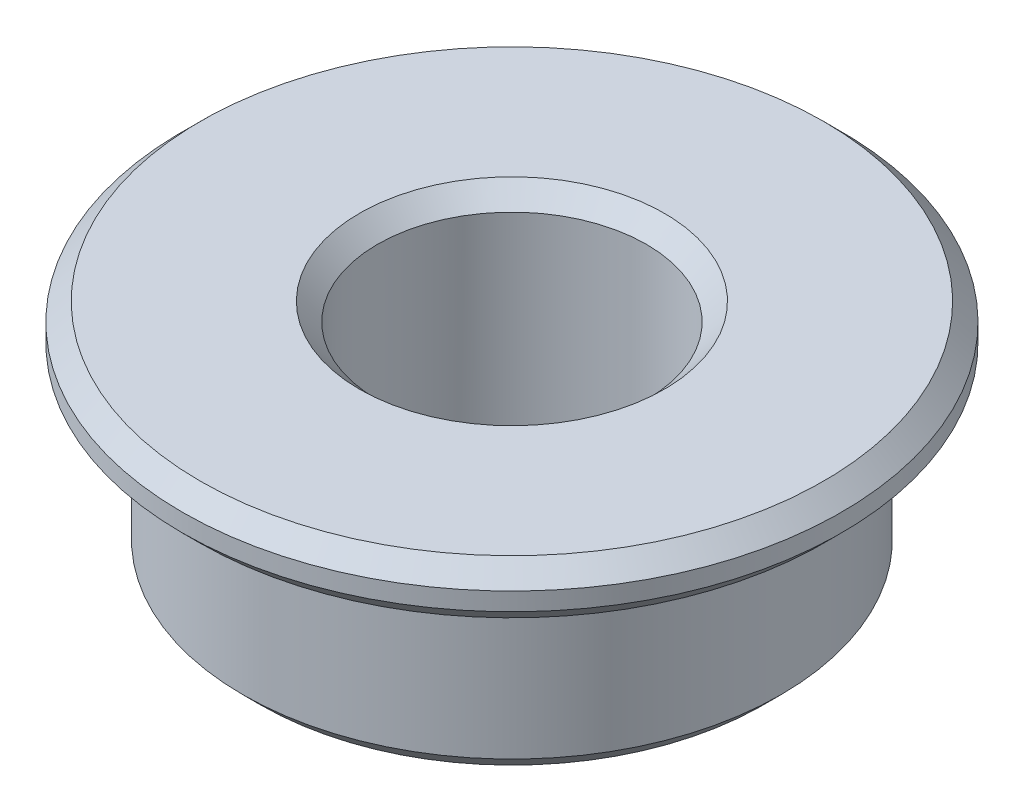
ISO-10303-21;
HEADER;
FILE_DESCRIPTION(('STEP AP214'),'2;1');
FILE_NAME('part.step','',(''),(''),'','','');
FILE_SCHEMA(('AUTOMOTIVE_DESIGN { 1 0 10303 214 1 1 1 1 }'));
ENDSEC;
DATA;
#1=APPLICATION_CONTEXT('core data for automotive mechanical design processes');
#2=APPLICATION_PROTOCOL_DEFINITION('international standard','automotive_design',2000,#1);
#3=PRODUCT_CONTEXT('',#1,'mechanical');
#4=PRODUCT('Part','Part','',(#3));
#5=PRODUCT_RELATED_PRODUCT_CATEGORY('part','',(#4));
#6=PRODUCT_DEFINITION_FORMATION('','',#4);
#7=PRODUCT_DEFINITION_CONTEXT('part definition',#1,'design');
#8=PRODUCT_DEFINITION('design','',#6,#7);
#9=PRODUCT_DEFINITION_SHAPE('','',#8);
#10=(LENGTH_UNIT() NAMED_UNIT(*) SI_UNIT(.MILLI.,.METRE.));
#11=(NAMED_UNIT(*) PLANE_ANGLE_UNIT() SI_UNIT($,.RADIAN.));
#12=(NAMED_UNIT(*) SI_UNIT($,.STERADIAN.) SOLID_ANGLE_UNIT());
#13=UNCERTAINTY_MEASURE_WITH_UNIT(LENGTH_MEASURE(1.E-05),#10,'distance_accuracy_value','');
#14=(GEOMETRIC_REPRESENTATION_CONTEXT(3) GLOBAL_UNCERTAINTY_ASSIGNED_CONTEXT((#13)) GLOBAL_UNIT_ASSIGNED_CONTEXT((#10,
#11,#12)) REPRESENTATION_CONTEXT('',''));
#15=CARTESIAN_POINT('',(0.,0.,0.));
#16=DIRECTION('',(0.,0.,1.));
#17=DIRECTION('',(1.,0.,0.));
#18=AXIS2_PLACEMENT_3D('',#15,#16,#17);
#19=CARTESIAN_POINT('',(0.,0.6,0.));
#20=DIRECTION('',(0.,1.,0.));
#21=DIRECTION('',(0.,0.,1.));
#22=AXIS2_PLACEMENT_3D('',#19,#20,#21);
#23=PLANE('',#22);
#24=CARTESIAN_POINT('',(0.,0.6,0.));
#25=DIRECTION('',(0.,1.,0.));
#26=DIRECTION('',(0.,0.,1.));
#27=AXIS2_PLACEMENT_3D('',#24,#25,#26);
#28=CIRCLE('',#27,1.7);
#29=CARTESIAN_POINT('',(0.,0.6,1.7));
#30=VERTEX_POINT('',#29);
#31=EDGE_CURVE('E48',#30,#30,#28,.F.);
#32=ORIENTED_EDGE('',*,*,#31,.T.);
#33=EDGE_LOOP('',(#32));
#34=FACE_BOUND('',#33,.T.);
#35=CARTESIAN_POINT('',(0.,0.6,0.));
#36=DIRECTION('',(0.,1.,0.));
#37=DIRECTION('',(0.,0.,1.));
#38=AXIS2_PLACEMENT_3D('',#35,#36,#37);
#39=CIRCLE('',#38,3.475);
#40=CARTESIAN_POINT('',(0.,0.6,3.475));
#41=VERTEX_POINT('',#40);
#42=EDGE_CURVE('E53',#41,#41,#39,.T.);
#43=ORIENTED_EDGE('',*,*,#42,.T.);
#44=EDGE_LOOP('',(#43));
#45=FACE_BOUND('',#44,.T.);
#46=ADVANCED_FACE('F32',(#34,#45),#23,.T.);
#47=CARTESIAN_POINT('',(0.,0.,0.));
#48=DIRECTION('',(0.,1.,0.));
#49=DIRECTION('',(0.,0.,1.));
#50=AXIS2_PLACEMENT_3D('',#47,#48,#49);
#51=PLANE('',#50);
#52=CARTESIAN_POINT('',(0.,0.,0.));
#53=DIRECTION('',(0.,1.,0.));
#54=DIRECTION('',(0.,0.,1.));
#55=AXIS2_PLACEMENT_3D('',#52,#53,#54);
#56=CIRCLE('',#55,3.475);
#57=CARTESIAN_POINT('',(0.,0.,3.475));
#58=VERTEX_POINT('',#57);
#59=EDGE_CURVE('E10',#58,#58,#56,.F.);
#60=ORIENTED_EDGE('',*,*,#59,.T.);
#61=EDGE_LOOP('',(#60));
#62=FACE_BOUND('',#61,.T.);
#63=CARTESIAN_POINT('',(0.,0.,0.));
#64=DIRECTION('',(0.,-1.,0.));
#65=DIRECTION('',(0.,0.,-1.));
#66=AXIS2_PLACEMENT_3D('',#63,#64,#65);
#67=CIRCLE('',#66,3.);
#68=CARTESIAN_POINT('',(0.,0.,3.));
#69=VERTEX_POINT('',#68);
#70=EDGE_CURVE('E71',#69,#69,#67,.T.);
#71=ORIENTED_EDGE('',*,*,#70,.F.);
#72=EDGE_LOOP('',(#71));
#73=FACE_BOUND('',#72,.T.);
#74=ADVANCED_FACE('F77',(#62,#73),#51,.F.);
#75=CARTESIAN_POINT('',(0.,0.6,0.));
#76=DIRECTION('',(0.,-1.,0.));
#77=DIRECTION('',(0.,0.,-1.));
#78=AXIS2_PLACEMENT_3D('',#75,#76,#77);
#79=CYLINDRICAL_SURFACE('',#78,3.675);
#80=CARTESIAN_POINT('',(0.,0.400000000000002,0.));
#81=DIRECTION('',(0.,1.,0.));
#82=DIRECTION('',(0.,0.,1.));
#83=AXIS2_PLACEMENT_3D('',#80,#81,#82);
#84=CIRCLE('',#83,3.675);
#85=CARTESIAN_POINT('',(0.,0.400000000000002,3.675));
#86=VERTEX_POINT('',#85);
#87=EDGE_CURVE('E40',#86,#86,#84,.F.);
#88=ORIENTED_EDGE('',*,*,#87,.T.);
#89=EDGE_LOOP('',(#88));
#90=FACE_BOUND('',#89,.T.);
#91=CARTESIAN_POINT('',(0.,0.200000000000001,0.));
#92=DIRECTION('',(0.,1.,0.));
#93=DIRECTION('',(0.,0.,1.));
#94=AXIS2_PLACEMENT_3D('',#91,#92,#93);
#95=CIRCLE('',#94,3.675);
#96=CARTESIAN_POINT('',(0.,0.200000000000001,3.675));
#97=VERTEX_POINT('',#96);
#98=EDGE_CURVE('E44',#97,#97,#95,.T.);
#99=ORIENTED_EDGE('',*,*,#98,.T.);
#100=EDGE_LOOP('',(#99));
#101=FACE_BOUND('',#100,.T.);
#102=ADVANCED_FACE('F79',(#90,#101),#79,.T.);
#103=CARTESIAN_POINT('',(0.,0.6,0.));
#104=DIRECTION('',(0.,-1.,0.));
#105=DIRECTION('',(0.,0.,-1.));
#106=AXIS2_PLACEMENT_3D('',#103,#104,#105);
#107=CYLINDRICAL_SURFACE('',#106,1.5);
#108=CARTESIAN_POINT('',(0.,-1.7,0.));
#109=DIRECTION('',(0.,-1.,0.));
#110=DIRECTION('',(0.,0.,-1.));
#111=AXIS2_PLACEMENT_3D('',#108,#109,#110);
#112=CIRCLE('',#111,1.5);
#113=CARTESIAN_POINT('',(0.,-1.7,-1.5));
#114=VERTEX_POINT('',#113);
#115=EDGE_CURVE('E65',#114,#114,#112,.T.);
#116=ORIENTED_EDGE('',*,*,#115,.T.);
#117=EDGE_LOOP('',(#116));
#118=FACE_BOUND('',#117,.T.);
#119=CARTESIAN_POINT('',(0.,0.399999999999999,0.));
#120=DIRECTION('',(0.,1.,0.));
#121=DIRECTION('',(0.,0.,1.));
#122=AXIS2_PLACEMENT_3D('',#119,#120,#121);
#123=CIRCLE('',#122,1.5);
#124=CARTESIAN_POINT('',(0.,0.399999999999999,1.5));
#125=VERTEX_POINT('',#124);
#126=EDGE_CURVE('E68',#125,#125,#123,.T.);
#127=ORIENTED_EDGE('',*,*,#126,.T.);
#128=EDGE_LOOP('',(#127));
#129=FACE_BOUND('',#128,.T.);
#130=ADVANCED_FACE('F85',(#118,#129),#107,.F.);
#131=CARTESIAN_POINT('',(0.,-1.9,0.));
#132=DIRECTION('',(0.,-1.,0.));
#133=DIRECTION('',(0.,0.,-1.));
#134=AXIS2_PLACEMENT_3D('',#131,#132,#133);
#135=PLANE('',#134);
#136=CARTESIAN_POINT('',(0.,-1.9,0.));
#137=DIRECTION('',(0.,-1.,0.));
#138=DIRECTION('',(0.,0.,-1.));
#139=AXIS2_PLACEMENT_3D('',#136,#137,#138);
#140=CIRCLE('',#139,1.7);
#141=CARTESIAN_POINT('',(0.,-1.9,-1.7));
#142=VERTEX_POINT('',#141);
#143=EDGE_CURVE('E59',#142,#142,#140,.F.);
#144=ORIENTED_EDGE('',*,*,#143,.T.);
#145=EDGE_LOOP('',(#144));
#146=FACE_BOUND('',#145,.T.);
#147=CARTESIAN_POINT('',(0.,-1.9,0.));
#148=DIRECTION('',(0.,-1.,0.));
#149=DIRECTION('',(0.,0.,-1.));
#150=AXIS2_PLACEMENT_3D('',#147,#148,#149);
#151=CIRCLE('',#150,2.80000000000001);
#152=CARTESIAN_POINT('',(0.,-1.9,2.80000000000001));
#153=VERTEX_POINT('',#152);
#154=EDGE_CURVE('E62',#153,#153,#151,.T.);
#155=ORIENTED_EDGE('',*,*,#154,.T.);
#156=EDGE_LOOP('',(#155));
#157=FACE_BOUND('',#156,.T.);
#158=ADVANCED_FACE('F160',(#146,#157),#135,.T.);
#159=CARTESIAN_POINT('',(0.,-1.9,0.));
#160=DIRECTION('',(0.,1.,0.));
#161=DIRECTION('',(0.,0.,1.));
#162=AXIS2_PLACEMENT_3D('',#159,#160,#161);
#163=CYLINDRICAL_SURFACE('',#162,3.);
#164=CARTESIAN_POINT('',(0.,-1.70000000000001,0.));
#165=DIRECTION('',(0.,-1.,0.));
#166=DIRECTION('',(0.,0.,-1.));
#167=AXIS2_PLACEMENT_3D('',#164,#165,#166);
#168=CIRCLE('',#167,3.);
#169=CARTESIAN_POINT('',(0.,-1.70000000000001,3.));
#170=VERTEX_POINT('',#169);
#171=EDGE_CURVE('E56',#170,#170,#168,.F.);
#172=CARTESIAN_POINT('',(0.,-1.70000000000001,3.));
#173=CARTESIAN_POINT('',(0.,-1.68229166666667,3.));
#174=CARTESIAN_POINT('',(0.,-1.66458333333334,3.));
#175=CARTESIAN_POINT('',(0.,-1.62916666666667,3.));
#176=CARTESIAN_POINT('',(0.,-1.61145833333334,3.));
#177=CARTESIAN_POINT('',(0.,-1.57604166666667,3.));
#178=CARTESIAN_POINT('',(0.,-1.55833333333334,3.));
#179=CARTESIAN_POINT('',(0.,-1.52291666666667,3.));
#180=CARTESIAN_POINT('',(0.,-1.50520833333334,3.));
#181=CARTESIAN_POINT('',(0.,-1.46979166666667,3.));
#182=CARTESIAN_POINT('',(0.,-1.45208333333334,3.));
#183=CARTESIAN_POINT('',(0.,-1.41666666666667,3.));
#184=CARTESIAN_POINT('',(0.,-1.39895833333334,3.));
#185=CARTESIAN_POINT('',(0.,-1.36354166666667,3.));
#186=CARTESIAN_POINT('',(0.,-1.34583333333334,3.));
#187=CARTESIAN_POINT('',(0.,-1.31041666666667,3.));
#188=CARTESIAN_POINT('',(0.,-1.29270833333334,3.));
#189=CARTESIAN_POINT('',(0.,-1.25729166666667,3.));
#190=CARTESIAN_POINT('',(0.,-1.23958333333334,3.));
#191=CARTESIAN_POINT('',(0.,-1.20416666666667,3.));
#192=CARTESIAN_POINT('',(0.,-1.18645833333334,3.));
#193=CARTESIAN_POINT('',(0.,-1.15104166666667,3.));
#194=CARTESIAN_POINT('',(0.,-1.13333333333334,3.));
#195=CARTESIAN_POINT('',(0.,-1.09791666666667,3.));
#196=CARTESIAN_POINT('',(0.,-1.08020833333334,3.));
#197=CARTESIAN_POINT('',(0.,-1.04479166666667,3.));
#198=CARTESIAN_POINT('',(0.,-1.02708333333334,3.));
#199=CARTESIAN_POINT('',(0.,-0.99166666666667,3.));
#200=CARTESIAN_POINT('',(0.,-0.973958333333336,3.));
#201=CARTESIAN_POINT('',(0.,-0.93854166666667,3.));
#202=CARTESIAN_POINT('',(0.,-0.920833333333336,3.));
#203=CARTESIAN_POINT('',(0.,-0.885416666666669,3.));
#204=CARTESIAN_POINT('',(0.,-0.867708333333336,3.));
#205=CARTESIAN_POINT('',(0.,-0.832291666666669,3.));
#206=CARTESIAN_POINT('',(0.,-0.814583333333336,3.));
#207=CARTESIAN_POINT('',(0.,-0.779166666666669,3.));
#208=CARTESIAN_POINT('',(0.,-0.761458333333336,3.));
#209=CARTESIAN_POINT('',(0.,-0.726041666666669,3.));
#210=CARTESIAN_POINT('',(0.,-0.708333333333336,3.));
#211=CARTESIAN_POINT('',(0.,-0.672916666666669,3.));
#212=CARTESIAN_POINT('',(0.,-0.655208333333336,3.));
#213=CARTESIAN_POINT('',(0.,-0.619791666666669,3.));
#214=CARTESIAN_POINT('',(0.,-0.602083333333335,3.));
#215=CARTESIAN_POINT('',(0.,-0.566666666666669,3.));
#216=CARTESIAN_POINT('',(0.,-0.548958333333335,3.));
#217=CARTESIAN_POINT('',(0.,-0.513541666666668,3.));
#218=CARTESIAN_POINT('',(0.,-0.495833333333335,3.));
#219=CARTESIAN_POINT('',(0.,-0.460416666666668,3.));
#220=CARTESIAN_POINT('',(0.,-0.442708333333335,3.));
#221=CARTESIAN_POINT('',(0.,-0.407291666666668,3.));
#222=CARTESIAN_POINT('',(0.,-0.389583333333335,3.));
#223=CARTESIAN_POINT('',(0.,-0.354166666666668,3.));
#224=CARTESIAN_POINT('',(0.,-0.336458333333334,3.));
#225=CARTESIAN_POINT('',(0.,-0.301041666666667,3.));
#226=CARTESIAN_POINT('',(0.,-0.283333333333334,3.));
#227=CARTESIAN_POINT('',(0.,-0.247916666666667,3.));
#228=CARTESIAN_POINT('',(0.,-0.230208333333334,3.));
#229=CARTESIAN_POINT('',(0.,-0.194791666666667,3.));
#230=CARTESIAN_POINT('',(0.,-0.177083333333334,3.));
#231=CARTESIAN_POINT('',(0.,-0.141666666666667,3.));
#232=CARTESIAN_POINT('',(0.,-0.123958333333334,3.));
#233=CARTESIAN_POINT('',(0.,-0.088541666666667,3.));
#234=CARTESIAN_POINT('',(0.,-0.0708333333333336,3.));
#235=CARTESIAN_POINT('',(0.,-0.0354166666666668,3.));
#236=CARTESIAN_POINT('',(0.,-0.0177083333333334,3.));
#237=CARTESIAN_POINT('',(0.,0.,3.));
#238=B_SPLINE_CURVE_WITH_KNOTS('',3,(#172,#173,#174,#175,#176,#177,#178,#179,#180,#181,#182,
#183,#184,#185,#186,#187,#188,#189,#190,#191,#192,#193,#194,#195,#196,#197,#198,#199,#200,#201,
#202,#203,#204,#205,#206,#207,#208,#209,#210,#211,#212,#213,#214,#215,#216,#217,#218,#219,#220,
#221,#222,#223,#224,#225,#226,#227,#228,#229,#230,#231,#232,#233,#234,#235,#236,#237),
.UNSPECIFIED.,.F.,.F.,(4,2,2,2,2,2,2,2,2,2,2,2,2,2,2,2,2,2,2,2,2,2,2,2,2,2,2,2,2,2,2,2,4),(0.,
0.0531250000000002,0.10625,0.159375000000001,0.212500000000001,0.265625000000001,
0.318750000000001,0.371875000000001,0.425000000000002,0.478125000000002,0.531250000000002,
0.584375000000002,0.637500000000002,0.690625000000002,0.743750000000003,0.796875000000003,
0.850000000000003,0.903125000000003,0.956250000000003,1.009375,1.0625,1.115625,1.16875,1.221875,
1.275,1.328125,1.38125,1.434375,1.48750000000001,1.54062500000001,1.59375000000001,
1.64687500000001,1.70000000000001),.UNSPECIFIED.);
#239=EDGE_CURVE('BSEAM75',#170,#69,#238,.T.);
#240=ORIENTED_EDGE('',*,*,#171,.T.);
#241=ORIENTED_EDGE('',*,*,#70,.T.);
#242=ORIENTED_EDGE('',*,*,#239,.T.);
#243=ORIENTED_EDGE('',*,*,#239,.F.);
#244=EDGE_LOOP('',(#240,#242,#241,#243));
#245=FACE_BOUND('',#244,.T.);
#246=ADVANCED_FACE('F75',(#245),#163,.T.);
#247=CARTESIAN_POINT('',(0.,-1.7,0.));
#248=DIRECTION('',(0.,-1.,0.));
#249=DIRECTION('',(0.,0.,-1.));
#250=AXIS2_PLACEMENT_3D('',#247,#248,#249);
#251=CONICAL_SURFACE('',#250,1.5,0.785398163397453);
#252=ORIENTED_EDGE('',*,*,#143,.F.);
#253=EDGE_LOOP('',(#252));
#254=FACE_BOUND('',#253,.T.);
#255=ORIENTED_EDGE('',*,*,#115,.F.);
#256=EDGE_LOOP('',(#255));
#257=FACE_BOUND('',#256,.T.);
#258=ADVANCED_FACE('F92',(#254,#257),#251,.F.);
#259=CARTESIAN_POINT('',(0.,-1.9,0.));
#260=DIRECTION('',(0.,1.,0.));
#261=DIRECTION('',(0.,0.,1.));
#262=AXIS2_PLACEMENT_3D('',#259,#260,#261);
#263=CONICAL_SURFACE('',#262,2.80000000000001,0.785398163397444);
#264=CARTESIAN_POINT('',(0.,-1.70000000000001,3.));
#265=CARTESIAN_POINT('',(0.,-1.70208333333334,2.99791666666667));
#266=CARTESIAN_POINT('',(0.,-1.70416666666667,2.99583333333333));
#267=CARTESIAN_POINT('',(0.,-1.70833333333334,2.99166666666667));
#268=CARTESIAN_POINT('',(0.,-1.71041666666667,2.98958333333333));
#269=CARTESIAN_POINT('',(0.,-1.71458333333334,2.98541666666667));
#270=CARTESIAN_POINT('',(0.,-1.71666666666667,2.98333333333333));
#271=CARTESIAN_POINT('',(0.,-1.72083333333334,2.97916666666667));
#272=CARTESIAN_POINT('',(0.,-1.72291666666667,2.97708333333333));
#273=CARTESIAN_POINT('',(0.,-1.72708333333334,2.97291666666667));
#274=CARTESIAN_POINT('',(0.,-1.72916666666667,2.97083333333333));
#275=CARTESIAN_POINT('',(0.,-1.73333333333334,2.96666666666667));
#276=CARTESIAN_POINT('',(0.,-1.73541666666667,2.96458333333334));
#277=CARTESIAN_POINT('',(0.,-1.73958333333334,2.96041666666667));
#278=CARTESIAN_POINT('',(0.,-1.74166666666667,2.95833333333334));
#279=CARTESIAN_POINT('',(0.,-1.74583333333334,2.95416666666667));
#280=CARTESIAN_POINT('',(0.,-1.74791666666667,2.95208333333334));
#281=CARTESIAN_POINT('',(0.,-1.75208333333334,2.94791666666667));
#282=CARTESIAN_POINT('',(0.,-1.75416666666667,2.94583333333334));
#283=CARTESIAN_POINT('',(0.,-1.75833333333334,2.94166666666667));
#284=CARTESIAN_POINT('',(0.,-1.76041666666667,2.93958333333334));
#285=CARTESIAN_POINT('',(0.,-1.76458333333334,2.93541666666667));
#286=CARTESIAN_POINT('',(0.,-1.76666666666667,2.93333333333334));
#287=CARTESIAN_POINT('',(0.,-1.77083333333334,2.92916666666667));
#288=CARTESIAN_POINT('',(0.,-1.77291666666667,2.92708333333334));
#289=CARTESIAN_POINT('',(0.,-1.77708333333334,2.92291666666667));
#290=CARTESIAN_POINT('',(0.,-1.77916666666667,2.92083333333334));
#291=CARTESIAN_POINT('',(0.,-1.78333333333334,2.91666666666667));
#292=CARTESIAN_POINT('',(0.,-1.78541666666667,2.91458333333334));
#293=CARTESIAN_POINT('',(0.,-1.78958333333334,2.91041666666667));
#294=CARTESIAN_POINT('',(0.,-1.79166666666667,2.90833333333334));
#295=CARTESIAN_POINT('',(0.,-1.79583333333334,2.90416666666667));
#296=CARTESIAN_POINT('',(0.,-1.79791666666667,2.90208333333334));
#297=CARTESIAN_POINT('',(0.,-1.80208333333334,2.89791666666667));
#298=CARTESIAN_POINT('',(0.,-1.80416666666667,2.89583333333334));
#299=CARTESIAN_POINT('',(0.,-1.80833333333334,2.89166666666667));
#300=CARTESIAN_POINT('',(0.,-1.81041666666667,2.88958333333334));
#301=CARTESIAN_POINT('',(0.,-1.81458333333334,2.88541666666667));
#302=CARTESIAN_POINT('',(0.,-1.81666666666667,2.88333333333334));
#303=CARTESIAN_POINT('',(0.,-1.82083333333334,2.87916666666667));
#304=CARTESIAN_POINT('',(0.,-1.82291666666667,2.87708333333334));
#305=CARTESIAN_POINT('',(0.,-1.82708333333334,2.87291666666667));
#306=CARTESIAN_POINT('',(0.,-1.82916666666667,2.87083333333334));
#307=CARTESIAN_POINT('',(0.,-1.83333333333334,2.86666666666667));
#308=CARTESIAN_POINT('',(0.,-1.83541666666667,2.86458333333334));
#309=CARTESIAN_POINT('',(0.,-1.83958333333333,2.86041666666667));
#310=CARTESIAN_POINT('',(0.,-1.84166666666667,2.85833333333334));
#311=CARTESIAN_POINT('',(0.,-1.84583333333333,2.85416666666667));
#312=CARTESIAN_POINT('',(0.,-1.84791666666667,2.85208333333334));
#313=CARTESIAN_POINT('',(0.,-1.85208333333333,2.84791666666667));
#314=CARTESIAN_POINT('',(0.,-1.85416666666667,2.84583333333334));
#315=CARTESIAN_POINT('',(0.,-1.85833333333333,2.84166666666667));
#316=CARTESIAN_POINT('',(0.,-1.86041666666667,2.83958333333334));
#317=CARTESIAN_POINT('',(0.,-1.86458333333333,2.83541666666667));
#318=CARTESIAN_POINT('',(0.,-1.86666666666667,2.83333333333334));
#319=CARTESIAN_POINT('',(0.,-1.87083333333333,2.82916666666667));
#320=CARTESIAN_POINT('',(0.,-1.87291666666667,2.82708333333334));
#321=CARTESIAN_POINT('',(0.,-1.87708333333333,2.82291666666667));
#322=CARTESIAN_POINT('',(0.,-1.87916666666667,2.82083333333334));
#323=CARTESIAN_POINT('',(0.,-1.88333333333333,2.81666666666667));
#324=CARTESIAN_POINT('',(0.,-1.88541666666667,2.81458333333334));
#325=CARTESIAN_POINT('',(0.,-1.88958333333333,2.81041666666667));
#326=CARTESIAN_POINT('',(0.,-1.89166666666667,2.80833333333334));
#327=CARTESIAN_POINT('',(0.,-1.89583333333333,2.80416666666667));
#328=CARTESIAN_POINT('',(0.,-1.89791666666667,2.80208333333334));
#329=CARTESIAN_POINT('',(0.,-1.9,2.80000000000001));
#330=B_SPLINE_CURVE_WITH_KNOTS('',3,(#264,#265,#266,#267,#268,#269,#270,#271,#272,#273,#274,
#275,#276,#277,#278,#279,#280,#281,#282,#283,#284,#285,#286,#287,#288,#289,#290,#291,#292,#293,
#294,#295,#296,#297,#298,#299,#300,#301,#302,#303,#304,#305,#306,#307,#308,#309,#310,#311,#312,
#313,#314,#315,#316,#317,#318,#319,#320,#321,#322,#323,#324,#325,#326,#327,#328,#329),
.UNSPECIFIED.,.F.,.F.,(4,2,2,2,2,2,2,2,2,2,2,2,2,2,2,2,2,2,2,2,2,2,2,2,2,2,2,2,2,2,2,2,4),(0.,
0.00883883476483148,0.017677669529663,0.0265165042944946,0.0353553390593261,0.0441941738241576,
0.0530330085889892,0.0618718433538207,0.0707106781186523,0.0795495128834838,0.0883883476483153,
0.0972271824131469,0.106066017177979,0.11490485194281,0.123743686707642,0.132582521472473,
0.141421356237305,0.150260191002136,0.159099025766968,0.1679378605318,0.176776695296631,
0.185615530061463,0.194454364826294,0.203293199591126,0.212132034355957,0.220970869120789,
0.22980970388562,0.238648538650452,0.247487373415283,0.256326208180115,0.265165042944947,
0.274003877709778,0.28284271247461),.UNSPECIFIED.);
#331=EDGE_CURVE('BSEAM98',#170,#153,#330,.T.);
#332=ORIENTED_EDGE('',*,*,#171,.F.);
#333=ORIENTED_EDGE('',*,*,#154,.F.);
#334=ORIENTED_EDGE('',*,*,#331,.T.);
#335=ORIENTED_EDGE('',*,*,#331,.F.);
#336=EDGE_LOOP('',(#332,#334,#333,#335));
#337=FACE_BOUND('',#336,.T.);
#338=ADVANCED_FACE('F98',(#337),#263,.T.);
#339=CARTESIAN_POINT('',(0.,0.399999999999999,0.));
#340=DIRECTION('',(0.,1.,0.));
#341=DIRECTION('',(0.,0.,1.));
#342=AXIS2_PLACEMENT_3D('',#339,#340,#341);
#343=CONICAL_SURFACE('',#342,1.5,0.785398163397451);
#344=ORIENTED_EDGE('',*,*,#31,.F.);
#345=EDGE_LOOP('',(#344));
#346=FACE_BOUND('',#345,.T.);
#347=ORIENTED_EDGE('',*,*,#126,.F.);
#348=EDGE_LOOP('',(#347));
#349=FACE_BOUND('',#348,.T.);
#350=ADVANCED_FACE('F105',(#346,#349),#343,.F.);
#351=CARTESIAN_POINT('',(0.,0.6,0.));
#352=DIRECTION('',(0.,-1.,0.));
#353=DIRECTION('',(0.,0.,-1.));
#354=AXIS2_PLACEMENT_3D('',#351,#352,#353);
#355=CONICAL_SURFACE('',#354,3.475,0.785398163397447);
#356=ORIENTED_EDGE('',*,*,#87,.F.);
#357=EDGE_LOOP('',(#356));
#358=FACE_BOUND('',#357,.T.);
#359=ORIENTED_EDGE('',*,*,#42,.F.);
#360=EDGE_LOOP('',(#359));
#361=FACE_BOUND('',#360,.T.);
#362=ADVANCED_FACE('F111',(#358,#361),#355,.T.);
#363=CARTESIAN_POINT('',(0.,0.200000000000001,0.));
#364=DIRECTION('',(0.,1.,0.));
#365=DIRECTION('',(0.,0.,1.));
#366=AXIS2_PLACEMENT_3D('',#363,#364,#365);
#367=CONICAL_SURFACE('',#366,3.675,0.78539816339745);
#368=ORIENTED_EDGE('',*,*,#59,.F.);
#369=EDGE_LOOP('',(#368));
#370=FACE_BOUND('',#369,.T.);
#371=ORIENTED_EDGE('',*,*,#98,.F.);
#372=EDGE_LOOP('',(#371));
#373=FACE_BOUND('',#372,.T.);
#374=ADVANCED_FACE('F35',(#370,#373),#367,.T.);
#375=CLOSED_SHELL('',(#46,#74,#102,#130,#158,#246,#258,#338,#350,#362,#374));
#376=MANIFOLD_SOLID_BREP('B2',#375);
#377=ADVANCED_BREP_SHAPE_REPRESENTATION('',(#18,#376),#14);
#378=SHAPE_DEFINITION_REPRESENTATION(#9,#377);
ENDSEC;
END-ISO-10303-21;
